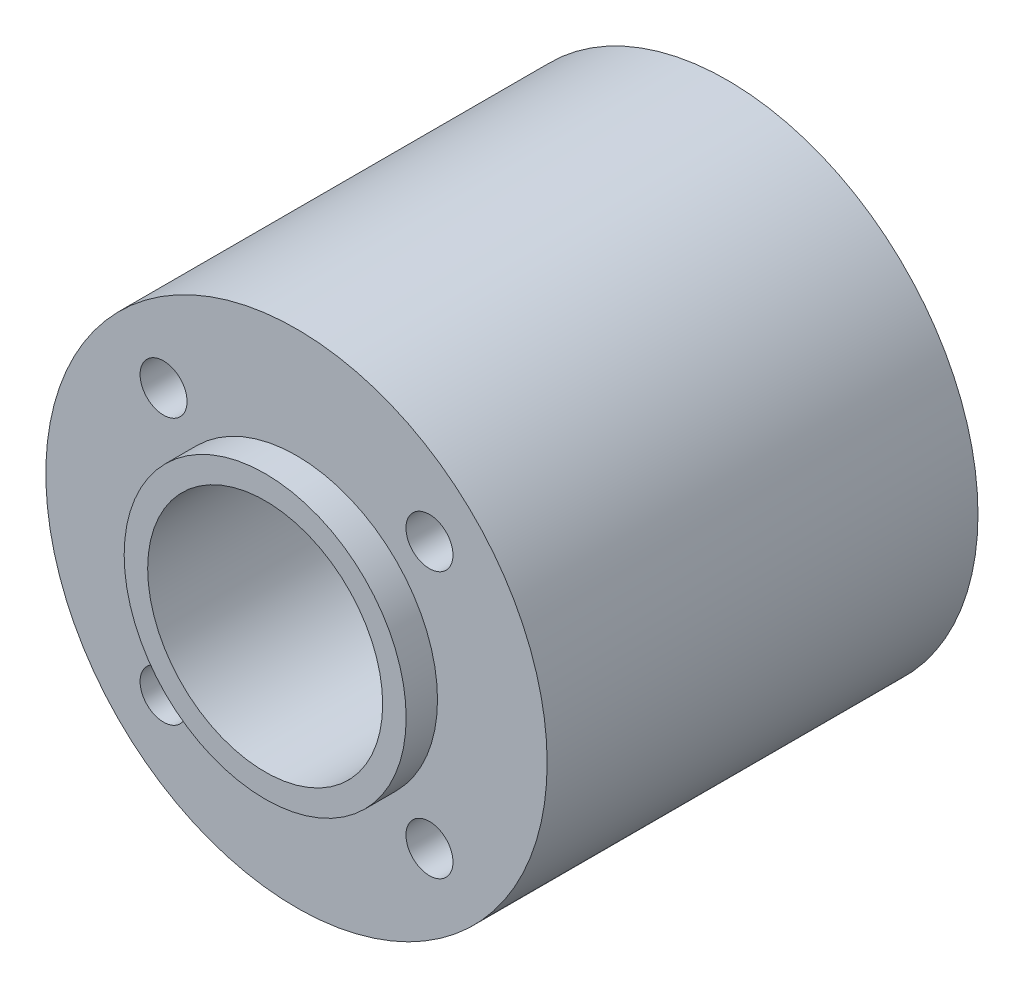
ISO-10303-21;
HEADER;
FILE_DESCRIPTION(('STEP AP214'),'2;1');
FILE_NAME('part.step','',(''),(''),'','','');
FILE_SCHEMA(('AUTOMOTIVE_DESIGN { 1 0 10303 214 1 1 1 1 }'));
ENDSEC;
DATA;
#1=APPLICATION_CONTEXT('core data for automotive mechanical design processes');
#2=APPLICATION_PROTOCOL_DEFINITION('international standard','automotive_design',2000,#1);
#3=PRODUCT_CONTEXT('',#1,'mechanical');
#4=PRODUCT('Part','Part','',(#3));
#5=PRODUCT_RELATED_PRODUCT_CATEGORY('part','',(#4));
#6=PRODUCT_DEFINITION_FORMATION('','',#4);
#7=PRODUCT_DEFINITION_CONTEXT('part definition',#1,'design');
#8=PRODUCT_DEFINITION('design','',#6,#7);
#9=PRODUCT_DEFINITION_SHAPE('','',#8);
#10=(LENGTH_UNIT() NAMED_UNIT(*) SI_UNIT(.MILLI.,.METRE.));
#11=(NAMED_UNIT(*) PLANE_ANGLE_UNIT() SI_UNIT($,.RADIAN.));
#12=(NAMED_UNIT(*) SI_UNIT($,.STERADIAN.) SOLID_ANGLE_UNIT());
#13=UNCERTAINTY_MEASURE_WITH_UNIT(LENGTH_MEASURE(1.E-05),#10,'distance_accuracy_value','');
#14=(GEOMETRIC_REPRESENTATION_CONTEXT(3) GLOBAL_UNCERTAINTY_ASSIGNED_CONTEXT((#13)) GLOBAL_UNIT_ASSIGNED_CONTEXT((#10,
#11,#12)) REPRESENTATION_CONTEXT('',''));
#15=CARTESIAN_POINT('',(0.,0.,0.));
#16=DIRECTION('',(0.,0.,1.));
#17=DIRECTION('',(1.,0.,0.));
#18=AXIS2_PLACEMENT_3D('',#15,#16,#17);
#19=CARTESIAN_POINT('',(0.,0.,0.));
#20=DIRECTION('',(0.,0.,1.));
#21=DIRECTION('',(1.,0.,0.));
#22=AXIS2_PLACEMENT_3D('',#19,#20,#21);
#23=PLANE('',#22);
#24=CARTESIAN_POINT('',(-8.48428131532002,-8.48628131530599,0.));
#25=DIRECTION('',(0.,0.,1.));
#26=DIRECTION('',(1.,0.,0.));
#27=AXIS2_PLACEMENT_3D('',#24,#25,#26);
#28=CIRCLE('',#27,1.5);
#29=CARTESIAN_POINT('',(-6.98428131532002,-8.48628131530599,0.));
#30=VERTEX_POINT('',#29);
#31=EDGE_CURVE('E172',#30,#30,#28,.T.);
#32=ORIENTED_EDGE('',*,*,#31,.F.);
#33=EDGE_LOOP('',(#32));
#34=FACE_BOUND('',#33,.T.);
#35=CARTESIAN_POINT('',(8.48728137422452,-8.48528125638742,0.));
#36=DIRECTION('',(0.,0.,1.));
#37=DIRECTION('',(1.,0.,0.));
#38=AXIS2_PLACEMENT_3D('',#35,#36,#37);
#39=CIRCLE('',#38,1.5);
#40=CARTESIAN_POINT('',(9.98728137422452,-8.48528125638742,0.));
#41=VERTEX_POINT('',#40);
#42=EDGE_CURVE('E168',#41,#41,#39,.T.);
#43=ORIENTED_EDGE('',*,*,#42,.F.);
#44=EDGE_LOOP('',(#43));
#45=FACE_BOUND('',#44,.T.);
#46=CARTESIAN_POINT('',(8.48628131530596,8.48628143315711,0.));
#47=DIRECTION('',(0.,0.,1.));
#48=DIRECTION('',(1.,0.,0.));
#49=AXIS2_PLACEMENT_3D('',#46,#47,#48);
#50=CIRCLE('',#49,1.5);
#51=CARTESIAN_POINT('',(9.98628131530596,8.48628143315711,0.));
#52=VERTEX_POINT('',#51);
#53=EDGE_CURVE('E157',#52,#52,#50,.T.);
#54=ORIENTED_EDGE('',*,*,#53,.F.);
#55=EDGE_LOOP('',(#54));
#56=FACE_BOUND('',#55,.T.);
#57=CARTESIAN_POINT('',(-8.48528131531302,8.48528143316412,0.));
#58=DIRECTION('',(0.,0.,1.));
#59=DIRECTION('',(1.,0.,0.));
#60=AXIS2_PLACEMENT_3D('',#57,#58,#59);
#61=CIRCLE('',#60,1.5);
#62=CARTESIAN_POINT('',(-6.98528131531302,8.48528143316412,0.));
#63=VERTEX_POINT('',#62);
#64=EDGE_CURVE('E69',#63,#63,#61,.T.);
#65=ORIENTED_EDGE('',*,*,#64,.F.);
#66=EDGE_LOOP('',(#65));
#67=FACE_BOUND('',#66,.T.);
#68=CARTESIAN_POINT('',(0.,0.,0.));
#69=DIRECTION('',(0.,0.,1.));
#70=DIRECTION('',(1.,0.,0.));
#71=AXIS2_PLACEMENT_3D('',#68,#69,#70);
#72=CIRCLE('',#71,16.);
#73=CARTESIAN_POINT('',(16.,0.,0.));
#74=VERTEX_POINT('',#73);
#75=EDGE_CURVE('E54',#74,#74,#72,.T.);
#76=ORIENTED_EDGE('',*,*,#75,.T.);
#77=EDGE_LOOP('',(#76));
#78=FACE_BOUND('',#77,.T.);
#79=CARTESIAN_POINT('',(0.,0.,0.));
#80=DIRECTION('',(0.,0.,1.));
#81=DIRECTION('',(1.,0.,0.));
#82=AXIS2_PLACEMENT_3D('',#79,#80,#81);
#83=CIRCLE('',#82,9.);
#84=CARTESIAN_POINT('',(9.,0.,0.));
#85=VERTEX_POINT('',#84);
#86=EDGE_CURVE('E62',#85,#85,#83,.T.);
#87=ORIENTED_EDGE('',*,*,#86,.F.);
#88=EDGE_LOOP('',(#87));
#89=FACE_BOUND('',#88,.T.);
#90=ADVANCED_FACE('F46',(#34,#45,#56,#67,#78,#89),#23,.T.);
#91=CARTESIAN_POINT('',(0.,0.,-27.5));
#92=DIRECTION('',(0.,0.,1.));
#93=DIRECTION('',(1.,0.,0.));
#94=AXIS2_PLACEMENT_3D('',#91,#92,#93);
#95=CYLINDRICAL_SURFACE('',#94,16.);
#96=CARTESIAN_POINT('',(0.,0.,-27.5));
#97=DIRECTION('',(0.,0.,1.));
#98=DIRECTION('',(1.,0.,0.));
#99=AXIS2_PLACEMENT_3D('',#96,#97,#98);
#100=CIRCLE('',#99,16.);
#101=CARTESIAN_POINT('',(16.,0.,-27.5));
#102=VERTEX_POINT('',#101);
#103=EDGE_CURVE('E11',#102,#102,#100,.T.);
#104=ORIENTED_EDGE('',*,*,#103,.T.);
#105=EDGE_LOOP('',(#104));
#106=FACE_BOUND('',#105,.T.);
#107=ORIENTED_EDGE('',*,*,#75,.F.);
#108=EDGE_LOOP('',(#107));
#109=FACE_BOUND('',#108,.T.);
#110=ADVANCED_FACE('F48',(#106,#109),#95,.T.);
#111=CARTESIAN_POINT('',(0.,0.,-27.5));
#112=DIRECTION('',(0.,0.,1.));
#113=DIRECTION('',(1.,0.,0.));
#114=AXIS2_PLACEMENT_3D('',#111,#112,#113);
#115=CYLINDRICAL_SURFACE('',#114,7.5);
#116=CARTESIAN_POINT('',(0.,0.,2.));
#117=DIRECTION('',(0.,0.,1.));
#118=DIRECTION('',(1.,0.,0.));
#119=AXIS2_PLACEMENT_3D('',#116,#117,#118);
#120=CIRCLE('',#119,7.5);
#121=CARTESIAN_POINT('',(7.5,0.,2.));
#122=VERTEX_POINT('',#121);
#123=EDGE_CURVE('E91',#122,#122,#120,.T.);
#124=ORIENTED_EDGE('',*,*,#123,.T.);
#125=EDGE_LOOP('',(#124));
#126=FACE_BOUND('',#125,.T.);
#127=CARTESIAN_POINT('',(0.,0.,-29.5));
#128=DIRECTION('',(0.,0.,1.));
#129=DIRECTION('',(1.,0.,0.));
#130=AXIS2_PLACEMENT_3D('',#127,#128,#129);
#131=CIRCLE('',#130,7.5);
#132=CARTESIAN_POINT('',(7.5,0.,-29.5));
#133=VERTEX_POINT('',#132);
#134=EDGE_CURVE('E76',#133,#133,#131,.T.);
#135=ORIENTED_EDGE('',*,*,#134,.F.);
#136=EDGE_LOOP('',(#135));
#137=FACE_BOUND('',#136,.T.);
#138=ADVANCED_FACE('F108',(#126,#137),#115,.F.);
#139=CARTESIAN_POINT('',(0.,0.,-27.5));
#140=DIRECTION('',(0.,0.,1.));
#141=DIRECTION('',(1.,0.,0.));
#142=AXIS2_PLACEMENT_3D('',#139,#140,#141);
#143=PLANE('',#142);
#144=CARTESIAN_POINT('',(-8.48428131532002,-8.48628131530599,-27.5));
#145=DIRECTION('',(0.,0.,1.));
#146=DIRECTION('',(1.,0.,0.));
#147=AXIS2_PLACEMENT_3D('',#144,#145,#146);
#148=CIRCLE('',#147,1.5);
#149=CARTESIAN_POINT('',(-6.98428131532002,-8.48628131530599,-27.5));
#150=VERTEX_POINT('',#149);
#151=EDGE_CURVE('E50',#150,#150,#148,.T.);
#152=ORIENTED_EDGE('',*,*,#151,.T.);
#153=EDGE_LOOP('',(#152));
#154=FACE_BOUND('',#153,.T.);
#155=CARTESIAN_POINT('',(8.48728137422452,-8.48528125638742,-27.5));
#156=DIRECTION('',(0.,0.,1.));
#157=DIRECTION('',(1.,0.,0.));
#158=AXIS2_PLACEMENT_3D('',#155,#156,#157);
#159=CIRCLE('',#158,1.5);
#160=CARTESIAN_POINT('',(9.98728137422452,-8.48528125638742,-27.5));
#161=VERTEX_POINT('',#160);
#162=EDGE_CURVE('E71',#161,#161,#159,.T.);
#163=ORIENTED_EDGE('',*,*,#162,.T.);
#164=EDGE_LOOP('',(#163));
#165=FACE_BOUND('',#164,.T.);
#166=CARTESIAN_POINT('',(8.48628131530596,8.48628143315711,-27.5));
#167=DIRECTION('',(0.,0.,1.));
#168=DIRECTION('',(1.,0.,0.));
#169=AXIS2_PLACEMENT_3D('',#166,#167,#168);
#170=CIRCLE('',#169,1.5);
#171=CARTESIAN_POINT('',(9.98628131530596,8.48628143315711,-27.5));
#172=VERTEX_POINT('',#171);
#173=EDGE_CURVE('E68',#172,#172,#170,.T.);
#174=ORIENTED_EDGE('',*,*,#173,.T.);
#175=EDGE_LOOP('',(#174));
#176=FACE_BOUND('',#175,.T.);
#177=CARTESIAN_POINT('',(-8.48528131531302,8.48528143316412,-27.5));
#178=DIRECTION('',(0.,0.,1.));
#179=DIRECTION('',(1.,0.,0.));
#180=AXIS2_PLACEMENT_3D('',#177,#178,#179);
#181=CIRCLE('',#180,1.5);
#182=CARTESIAN_POINT('',(-6.98528131531302,8.48528143316412,-27.5));
#183=VERTEX_POINT('',#182);
#184=EDGE_CURVE('E65',#183,#183,#181,.T.);
#185=ORIENTED_EDGE('',*,*,#184,.T.);
#186=EDGE_LOOP('',(#185));
#187=FACE_BOUND('',#186,.T.);
#188=CARTESIAN_POINT('',(0.,0.,-27.5));
#189=DIRECTION('',(0.,0.,1.));
#190=DIRECTION('',(1.,0.,0.));
#191=AXIS2_PLACEMENT_3D('',#188,#189,#190);
#192=CIRCLE('',#191,9.);
#193=CARTESIAN_POINT('',(9.,0.,-27.5));
#194=VERTEX_POINT('',#193);
#195=EDGE_CURVE('E80',#194,#194,#192,.T.);
#196=ORIENTED_EDGE('',*,*,#195,.T.);
#197=EDGE_LOOP('',(#196));
#198=FACE_BOUND('',#197,.T.);
#199=ORIENTED_EDGE('',*,*,#103,.F.);
#200=EDGE_LOOP('',(#199));
#201=FACE_BOUND('',#200,.T.);
#202=ADVANCED_FACE('F112',(#154,#165,#176,#187,#198,#201),#143,.F.);
#203=CARTESIAN_POINT('',(0.,0.,2.));
#204=DIRECTION('',(0.,0.,1.));
#205=DIRECTION('',(1.,0.,0.));
#206=AXIS2_PLACEMENT_3D('',#203,#204,#205);
#207=PLANE('',#206);
#208=CARTESIAN_POINT('',(0.,0.,2.));
#209=DIRECTION('',(0.,0.,1.));
#210=DIRECTION('',(1.,0.,0.));
#211=AXIS2_PLACEMENT_3D('',#208,#209,#210);
#212=CIRCLE('',#211,9.);
#213=CARTESIAN_POINT('',(9.,0.,2.));
#214=VERTEX_POINT('',#213);
#215=EDGE_CURVE('E59',#214,#214,#212,.T.);
#216=ORIENTED_EDGE('',*,*,#215,.T.);
#217=EDGE_LOOP('',(#216));
#218=FACE_BOUND('',#217,.T.);
#219=ORIENTED_EDGE('',*,*,#123,.F.);
#220=EDGE_LOOP('',(#219));
#221=FACE_BOUND('',#220,.T.);
#222=ADVANCED_FACE('F119',(#218,#221),#207,.T.);
#223=CARTESIAN_POINT('',(0.,0.,2.));
#224=DIRECTION('',(0.,0.,-1.));
#225=DIRECTION('',(-1.,0.,0.));
#226=AXIS2_PLACEMENT_3D('',#223,#224,#225);
#227=CYLINDRICAL_SURFACE('',#226,9.);
#228=ORIENTED_EDGE('',*,*,#215,.F.);
#229=EDGE_LOOP('',(#228));
#230=FACE_BOUND('',#229,.T.);
#231=ORIENTED_EDGE('',*,*,#86,.T.);
#232=EDGE_LOOP('',(#231));
#233=FACE_BOUND('',#232,.T.);
#234=ADVANCED_FACE('F100',(#230,#233),#227,.T.);
#235=CARTESIAN_POINT('',(0.,0.,-29.5));
#236=DIRECTION('',(0.,0.,1.));
#237=DIRECTION('',(1.,0.,0.));
#238=AXIS2_PLACEMENT_3D('',#235,#236,#237);
#239=CYLINDRICAL_SURFACE('',#238,9.);
#240=CARTESIAN_POINT('',(0.,0.,-29.5));
#241=DIRECTION('',(0.,0.,1.));
#242=DIRECTION('',(1.,0.,0.));
#243=AXIS2_PLACEMENT_3D('',#240,#241,#242);
#244=CIRCLE('',#243,9.);
#245=CARTESIAN_POINT('',(9.,0.,-29.5));
#246=VERTEX_POINT('',#245);
#247=EDGE_CURVE('E85',#246,#246,#244,.T.);
#248=ORIENTED_EDGE('',*,*,#247,.T.);
#249=EDGE_LOOP('',(#248));
#250=FACE_BOUND('',#249,.T.);
#251=ORIENTED_EDGE('',*,*,#195,.F.);
#252=EDGE_LOOP('',(#251));
#253=FACE_BOUND('',#252,.T.);
#254=ADVANCED_FACE('F128',(#250,#253),#239,.T.);
#255=CARTESIAN_POINT('',(0.,0.,-29.5));
#256=DIRECTION('',(0.,0.,1.));
#257=DIRECTION('',(1.,0.,0.));
#258=AXIS2_PLACEMENT_3D('',#255,#256,#257);
#259=PLANE('',#258);
#260=ORIENTED_EDGE('',*,*,#134,.T.);
#261=EDGE_LOOP('',(#260));
#262=FACE_BOUND('',#261,.T.);
#263=ORIENTED_EDGE('',*,*,#247,.F.);
#264=EDGE_LOOP('',(#263));
#265=FACE_BOUND('',#264,.T.);
#266=ADVANCED_FACE('F133',(#262,#265),#259,.F.);
#267=CARTESIAN_POINT('',(-8.48528131531302,8.48528143316412,-29.5));
#268=DIRECTION('',(0.,0.,1.));
#269=DIRECTION('',(1.,0.,0.));
#270=AXIS2_PLACEMENT_3D('',#267,#268,#269);
#271=CYLINDRICAL_SURFACE('',#270,1.5);
#272=ORIENTED_EDGE('',*,*,#64,.T.);
#273=EDGE_LOOP('',(#272));
#274=FACE_BOUND('',#273,.T.);
#275=ORIENTED_EDGE('',*,*,#184,.F.);
#276=EDGE_LOOP('',(#275));
#277=FACE_BOUND('',#276,.T.);
#278=ADVANCED_FACE('F137',(#274,#277),#271,.F.);
#279=CARTESIAN_POINT('',(8.48628131530596,8.48628143315711,-29.5));
#280=DIRECTION('',(0.,0.,1.));
#281=DIRECTION('',(1.,0.,0.));
#282=AXIS2_PLACEMENT_3D('',#279,#280,#281);
#283=CYLINDRICAL_SURFACE('',#282,1.5);
#284=ORIENTED_EDGE('',*,*,#53,.T.);
#285=EDGE_LOOP('',(#284));
#286=FACE_BOUND('',#285,.T.);
#287=ORIENTED_EDGE('',*,*,#173,.F.);
#288=EDGE_LOOP('',(#287));
#289=FACE_BOUND('',#288,.T.);
#290=ADVANCED_FACE('F140',(#286,#289),#283,.F.);
#291=CARTESIAN_POINT('',(8.48728137422452,-8.48528125638742,-29.5));
#292=DIRECTION('',(0.,0.,1.));
#293=DIRECTION('',(1.,0.,0.));
#294=AXIS2_PLACEMENT_3D('',#291,#292,#293);
#295=CYLINDRICAL_SURFACE('',#294,1.5);
#296=ORIENTED_EDGE('',*,*,#42,.T.);
#297=EDGE_LOOP('',(#296));
#298=FACE_BOUND('',#297,.T.);
#299=ORIENTED_EDGE('',*,*,#162,.F.);
#300=EDGE_LOOP('',(#299));
#301=FACE_BOUND('',#300,.T.);
#302=ADVANCED_FACE('F145',(#298,#301),#295,.F.);
#303=CARTESIAN_POINT('',(-8.48428131532002,-8.48628131530599,-29.5));
#304=DIRECTION('',(0.,0.,1.));
#305=DIRECTION('',(1.,0.,0.));
#306=AXIS2_PLACEMENT_3D('',#303,#304,#305);
#307=CYLINDRICAL_SURFACE('',#306,1.5);
#308=ORIENTED_EDGE('',*,*,#31,.T.);
#309=EDGE_LOOP('',(#308));
#310=FACE_BOUND('',#309,.T.);
#311=ORIENTED_EDGE('',*,*,#151,.F.);
#312=EDGE_LOOP('',(#311));
#313=FACE_BOUND('',#312,.T.);
#314=ADVANCED_FACE('F142',(#310,#313),#307,.F.);
#315=CLOSED_SHELL('',(#90,#110,#138,#202,#222,#234,#254,#266,#278,#290,#302,#314));
#316=MANIFOLD_SOLID_BREP('B2',#315);
#317=ADVANCED_BREP_SHAPE_REPRESENTATION('',(#18,#316),#14);
#318=SHAPE_DEFINITION_REPRESENTATION(#9,#317);
ENDSEC;
END-ISO-10303-21;
